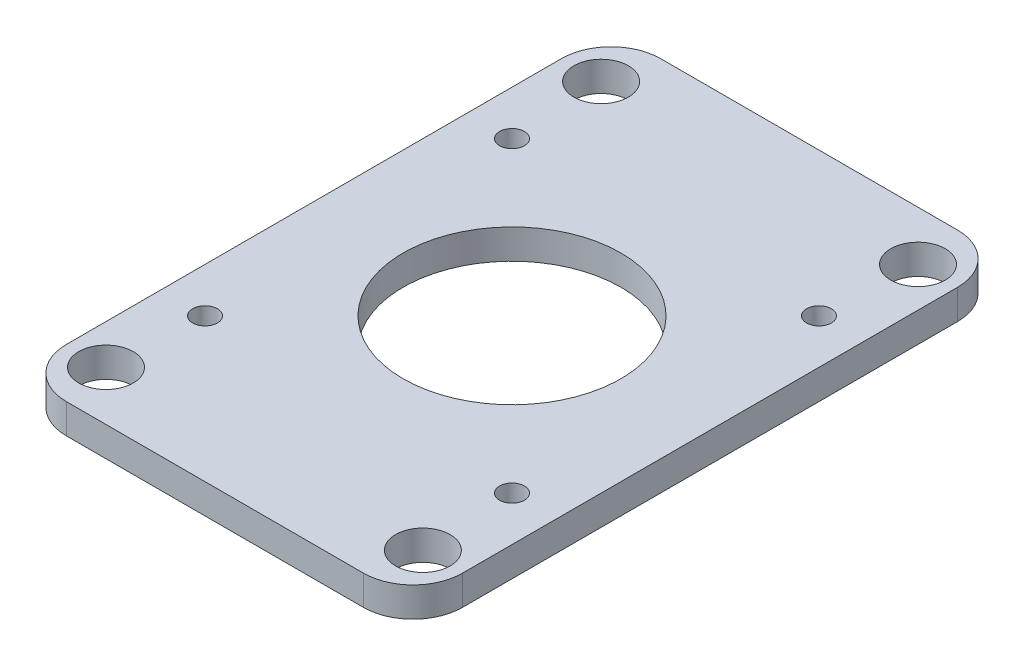
ISO-10303-21;
HEADER;
FILE_DESCRIPTION(('STEP AP214'),'2;1');
FILE_NAME('part.step','',(''),(''),'','','');
FILE_SCHEMA(('AUTOMOTIVE_DESIGN { 1 0 10303 214 1 1 1 1 }'));
ENDSEC;
DATA;
#1=APPLICATION_CONTEXT('core data for automotive mechanical design processes');
#2=APPLICATION_PROTOCOL_DEFINITION('international standard','automotive_design',2000,#1);
#3=PRODUCT_CONTEXT('',#1,'mechanical');
#4=PRODUCT('Part','Part','',(#3));
#5=PRODUCT_RELATED_PRODUCT_CATEGORY('part','',(#4));
#6=PRODUCT_DEFINITION_FORMATION('','',#4);
#7=PRODUCT_DEFINITION_CONTEXT('part definition',#1,'design');
#8=PRODUCT_DEFINITION('design','',#6,#7);
#9=PRODUCT_DEFINITION_SHAPE('','',#8);
#10=(LENGTH_UNIT() NAMED_UNIT(*) SI_UNIT(.MILLI.,.METRE.));
#11=(NAMED_UNIT(*) PLANE_ANGLE_UNIT() SI_UNIT($,.RADIAN.));
#12=(NAMED_UNIT(*) SI_UNIT($,.STERADIAN.) SOLID_ANGLE_UNIT());
#13=UNCERTAINTY_MEASURE_WITH_UNIT(LENGTH_MEASURE(1.E-05),#10,'distance_accuracy_value','');
#14=(GEOMETRIC_REPRESENTATION_CONTEXT(3) GLOBAL_UNCERTAINTY_ASSIGNED_CONTEXT((#13)) GLOBAL_UNIT_ASSIGNED_CONTEXT((#10,
#11,#12)) REPRESENTATION_CONTEXT('',''));
#15=CARTESIAN_POINT('',(0.,0.,0.));
#16=DIRECTION('',(0.,0.,1.));
#17=DIRECTION('',(1.,0.,0.));
#18=AXIS2_PLACEMENT_3D('',#15,#16,#17);
#19=CARTESIAN_POINT('',(20.,3.,0.));
#20=DIRECTION('',(1.,0.,0.));
#21=DIRECTION('',(0.,0.,-1.));
#22=AXIS2_PLACEMENT_3D('',#19,#20,#21);
#23=PLANE('',#22);
#24=DIRECTION('',(0.,0.,1.));
#25=VECTOR('',#24,1.);
#26=CARTESIAN_POINT('',(20.,3.,0.));
#27=LINE('',#26,#25);
#28=CARTESIAN_POINT('',(20.,3.,-25.));
#29=VERTEX_POINT('',#28);
#30=CARTESIAN_POINT('',(20.,3.,25.));
#31=VERTEX_POINT('',#30);
#32=EDGE_CURVE('E176',#29,#31,#27,.T.);
#33=ORIENTED_EDGE('',*,*,#32,.T.);
#34=DIRECTION('',(0.,-1.,0.));
#35=VECTOR('',#34,1.);
#36=CARTESIAN_POINT('',(20.,0.,25.));
#37=LINE('',#36,#35);
#38=CARTESIAN_POINT('',(20.,0.,25.));
#39=VERTEX_POINT('',#38);
#40=EDGE_CURVE('E168',#31,#39,#37,.T.);
#41=ORIENTED_EDGE('',*,*,#40,.T.);
#42=DIRECTION('',(0.,0.,1.));
#43=VECTOR('',#42,1.);
#44=CARTESIAN_POINT('',(20.,0.,0.));
#45=LINE('',#44,#43);
#46=CARTESIAN_POINT('',(20.,0.,-25.));
#47=VERTEX_POINT('',#46);
#48=EDGE_CURVE('E174',#47,#39,#45,.T.);
#49=ORIENTED_EDGE('',*,*,#48,.F.);
#50=DIRECTION('',(0.,-1.,0.));
#51=VECTOR('',#50,1.);
#52=CARTESIAN_POINT('',(20.,3.,-25.));
#53=LINE('',#52,#51);
#54=EDGE_CURVE('E166',#47,#29,#53,.F.);
#55=ORIENTED_EDGE('',*,*,#54,.T.);
#56=EDGE_LOOP('',(#33,#41,#49,#55));
#57=FACE_BOUND('',#56,.T.);
#58=ADVANCED_FACE('F35',(#57),#23,.T.);
#59=CARTESIAN_POINT('',(0.,3.,-30.));
#60=DIRECTION('',(0.,0.,-1.));
#61=DIRECTION('',(-1.,0.,0.));
#62=AXIS2_PLACEMENT_3D('',#59,#60,#61);
#63=PLANE('',#62);
#64=DIRECTION('',(1.,0.,0.));
#65=VECTOR('',#64,1.);
#66=CARTESIAN_POINT('',(0.,3.,-30.));
#67=LINE('',#66,#65);
#68=CARTESIAN_POINT('',(-15.,3.,-30.));
#69=VERTEX_POINT('',#68);
#70=CARTESIAN_POINT('',(15.,3.,-30.));
#71=VERTEX_POINT('',#70);
#72=EDGE_CURVE('E212',#69,#71,#67,.T.);
#73=ORIENTED_EDGE('',*,*,#72,.T.);
#74=DIRECTION('',(0.,-1.,0.));
#75=VECTOR('',#74,1.);
#76=CARTESIAN_POINT('',(15.,3.,-30.));
#77=LINE('',#76,#75);
#78=CARTESIAN_POINT('',(15.,0.,-30.));
#79=VERTEX_POINT('',#78);
#80=EDGE_CURVE('E11',#71,#79,#77,.T.);
#81=ORIENTED_EDGE('',*,*,#80,.T.);
#82=DIRECTION('',(1.,0.,0.));
#83=VECTOR('',#82,1.);
#84=CARTESIAN_POINT('',(0.,0.,-30.));
#85=LINE('',#84,#83);
#86=CARTESIAN_POINT('',(-15.,0.,-30.));
#87=VERTEX_POINT('',#86);
#88=EDGE_CURVE('E134',#87,#79,#85,.T.);
#89=ORIENTED_EDGE('',*,*,#88,.F.);
#90=DIRECTION('',(0.,-1.,0.));
#91=VECTOR('',#90,1.);
#92=CARTESIAN_POINT('',(-15.,3.,-30.));
#93=LINE('',#92,#91);
#94=EDGE_CURVE('E43',#87,#69,#93,.F.);
#95=ORIENTED_EDGE('',*,*,#94,.T.);
#96=EDGE_LOOP('',(#73,#81,#89,#95));
#97=FACE_BOUND('',#96,.T.);
#98=ADVANCED_FACE('F267',(#97),#63,.T.);
#99=CARTESIAN_POINT('',(-20.,3.,0.));
#100=DIRECTION('',(1.,0.,0.));
#101=DIRECTION('',(0.,0.,-1.));
#102=AXIS2_PLACEMENT_3D('',#99,#100,#101);
#103=PLANE('',#102);
#104=DIRECTION('',(0.,0.,1.));
#105=VECTOR('',#104,1.);
#106=CARTESIAN_POINT('',(-20.,0.,0.));
#107=LINE('',#106,#105);
#108=CARTESIAN_POINT('',(-20.,0.,-25.));
#109=VERTEX_POINT('',#108);
#110=CARTESIAN_POINT('',(-20.,0.,25.));
#111=VERTEX_POINT('',#110);
#112=EDGE_CURVE('E129',#109,#111,#107,.T.);
#113=ORIENTED_EDGE('',*,*,#112,.T.);
#114=DIRECTION('',(0.,-1.,0.));
#115=VECTOR('',#114,1.);
#116=CARTESIAN_POINT('',(-20.,3.,25.));
#117=LINE('',#116,#115);
#118=CARTESIAN_POINT('',(-20.,3.,25.));
#119=VERTEX_POINT('',#118);
#120=EDGE_CURVE('E106',#111,#119,#117,.F.);
#121=ORIENTED_EDGE('',*,*,#120,.T.);
#122=DIRECTION('',(0.,0.,1.));
#123=VECTOR('',#122,1.);
#124=CARTESIAN_POINT('',(-20.,3.,0.));
#125=LINE('',#124,#123);
#126=CARTESIAN_POINT('',(-20.,3.,-25.));
#127=VERTEX_POINT('',#126);
#128=EDGE_CURVE('E209',#127,#119,#125,.T.);
#129=ORIENTED_EDGE('',*,*,#128,.F.);
#130=DIRECTION('',(0.,-1.,0.));
#131=VECTOR('',#130,1.);
#132=CARTESIAN_POINT('',(-20.,0.,-25.));
#133=LINE('',#132,#131);
#134=EDGE_CURVE('E111',#127,#109,#133,.T.);
#135=ORIENTED_EDGE('',*,*,#134,.T.);
#136=EDGE_LOOP('',(#113,#121,#129,#135));
#137=FACE_BOUND('',#136,.T.);
#138=ADVANCED_FACE('F272',(#137),#103,.F.);
#139=CARTESIAN_POINT('',(-15.5,3.,15.5));
#140=DIRECTION('',(0.,-1.,0.));
#141=DIRECTION('',(0.,0.,-1.));
#142=AXIS2_PLACEMENT_3D('',#139,#140,#141);
#143=CYLINDRICAL_SURFACE('',#142,1.25);
#144=CARTESIAN_POINT('',(-15.5,3.,15.5));
#145=DIRECTION('',(0.,1.,0.));
#146=DIRECTION('',(0.,0.,1.));
#147=AXIS2_PLACEMENT_3D('',#144,#145,#146);
#148=CIRCLE('',#147,1.25);
#149=CARTESIAN_POINT('',(-15.5,3.,16.75));
#150=VERTEX_POINT('',#149);
#151=EDGE_CURVE('E196',#150,#150,#148,.T.);
#152=ORIENTED_EDGE('',*,*,#151,.T.);
#153=EDGE_LOOP('',(#152));
#154=FACE_BOUND('',#153,.T.);
#155=CARTESIAN_POINT('',(-15.5,0.,15.5));
#156=DIRECTION('',(0.,1.,0.));
#157=DIRECTION('',(0.,0.,1.));
#158=AXIS2_PLACEMENT_3D('',#155,#156,#157);
#159=CIRCLE('',#158,1.25);
#160=CARTESIAN_POINT('',(-15.5,0.,16.75));
#161=VERTEX_POINT('',#160);
#162=EDGE_CURVE('E143',#161,#161,#159,.T.);
#163=ORIENTED_EDGE('',*,*,#162,.F.);
#164=EDGE_LOOP('',(#163));
#165=FACE_BOUND('',#164,.T.);
#166=ADVANCED_FACE('F303',(#154,#165),#143,.F.);
#167=CARTESIAN_POINT('',(-15.5,3.,-15.5));
#168=DIRECTION('',(0.,-1.,0.));
#169=DIRECTION('',(0.,0.,-1.));
#170=AXIS2_PLACEMENT_3D('',#167,#168,#169);
#171=CYLINDRICAL_SURFACE('',#170,1.25);
#172=CARTESIAN_POINT('',(-15.5,3.,-15.5));
#173=DIRECTION('',(0.,1.,0.));
#174=DIRECTION('',(0.,0.,1.));
#175=AXIS2_PLACEMENT_3D('',#172,#173,#174);
#176=CIRCLE('',#175,1.25);
#177=CARTESIAN_POINT('',(-15.5,3.,-14.25));
#178=VERTEX_POINT('',#177);
#179=EDGE_CURVE('E199',#178,#178,#176,.T.);
#180=ORIENTED_EDGE('',*,*,#179,.T.);
#181=EDGE_LOOP('',(#180));
#182=FACE_BOUND('',#181,.T.);
#183=CARTESIAN_POINT('',(-15.5,0.,-15.5));
#184=DIRECTION('',(0.,1.,0.));
#185=DIRECTION('',(0.,0.,1.));
#186=AXIS2_PLACEMENT_3D('',#183,#184,#185);
#187=CIRCLE('',#186,1.25);
#188=CARTESIAN_POINT('',(-15.5,0.,-14.25));
#189=VERTEX_POINT('',#188);
#190=EDGE_CURVE('E140',#189,#189,#187,.T.);
#191=ORIENTED_EDGE('',*,*,#190,.F.);
#192=EDGE_LOOP('',(#191));
#193=FACE_BOUND('',#192,.T.);
#194=ADVANCED_FACE('F307',(#182,#193),#171,.F.);
#195=CARTESIAN_POINT('',(15.5,3.,-15.5));
#196=DIRECTION('',(0.,-1.,0.));
#197=DIRECTION('',(0.,0.,-1.));
#198=AXIS2_PLACEMENT_3D('',#195,#196,#197);
#199=CYLINDRICAL_SURFACE('',#198,1.25);
#200=CARTESIAN_POINT('',(15.5,3.,-15.5));
#201=DIRECTION('',(0.,1.,0.));
#202=DIRECTION('',(0.,0.,1.));
#203=AXIS2_PLACEMENT_3D('',#200,#201,#202);
#204=CIRCLE('',#203,1.25);
#205=CARTESIAN_POINT('',(15.5,3.,-14.25));
#206=VERTEX_POINT('',#205);
#207=EDGE_CURVE('E202',#206,#206,#204,.T.);
#208=ORIENTED_EDGE('',*,*,#207,.T.);
#209=EDGE_LOOP('',(#208));
#210=FACE_BOUND('',#209,.T.);
#211=CARTESIAN_POINT('',(15.5,0.,-15.5));
#212=DIRECTION('',(0.,1.,0.));
#213=DIRECTION('',(0.,0.,1.));
#214=AXIS2_PLACEMENT_3D('',#211,#212,#213);
#215=CIRCLE('',#214,1.25);
#216=CARTESIAN_POINT('',(15.5,0.,-14.25));
#217=VERTEX_POINT('',#216);
#218=EDGE_CURVE('E132',#217,#217,#215,.T.);
#219=ORIENTED_EDGE('',*,*,#218,.F.);
#220=EDGE_LOOP('',(#219));
#221=FACE_BOUND('',#220,.T.);
#222=ADVANCED_FACE('F316',(#210,#221),#199,.F.);
#223=CARTESIAN_POINT('',(15.5,3.,15.5));
#224=DIRECTION('',(0.,-1.,0.));
#225=DIRECTION('',(0.,0.,-1.));
#226=AXIS2_PLACEMENT_3D('',#223,#224,#225);
#227=CYLINDRICAL_SURFACE('',#226,1.25);
#228=CARTESIAN_POINT('',(15.5,3.,15.5));
#229=DIRECTION('',(0.,1.,0.));
#230=DIRECTION('',(0.,0.,1.));
#231=AXIS2_PLACEMENT_3D('',#228,#229,#230);
#232=CIRCLE('',#231,1.25);
#233=CARTESIAN_POINT('',(15.5,3.,16.75));
#234=VERTEX_POINT('',#233);
#235=EDGE_CURVE('E205',#234,#234,#232,.T.);
#236=ORIENTED_EDGE('',*,*,#235,.T.);
#237=EDGE_LOOP('',(#236));
#238=FACE_BOUND('',#237,.T.);
#239=CARTESIAN_POINT('',(15.5,0.,15.5));
#240=DIRECTION('',(0.,1.,0.));
#241=DIRECTION('',(0.,0.,1.));
#242=AXIS2_PLACEMENT_3D('',#239,#240,#241);
#243=CIRCLE('',#242,1.25);
#244=CARTESIAN_POINT('',(15.5,0.,16.75));
#245=VERTEX_POINT('',#244);
#246=EDGE_CURVE('E128',#245,#245,#243,.T.);
#247=ORIENTED_EDGE('',*,*,#246,.F.);
#248=EDGE_LOOP('',(#247));
#249=FACE_BOUND('',#248,.T.);
#250=ADVANCED_FACE('F313',(#238,#249),#227,.F.);
#251=CARTESIAN_POINT('',(0.,3.,30.));
#252=DIRECTION('',(0.,0.,-1.));
#253=DIRECTION('',(-1.,0.,0.));
#254=AXIS2_PLACEMENT_3D('',#251,#252,#253);
#255=PLANE('',#254);
#256=DIRECTION('',(1.,0.,0.));
#257=VECTOR('',#256,1.);
#258=CARTESIAN_POINT('',(0.,3.,30.));
#259=LINE('',#258,#257);
#260=CARTESIAN_POINT('',(-15.,3.,30.));
#261=VERTEX_POINT('',#260);
#262=CARTESIAN_POINT('',(15.,3.,30.));
#263=VERTEX_POINT('',#262);
#264=EDGE_CURVE('E121',#261,#263,#259,.T.);
#265=ORIENTED_EDGE('',*,*,#264,.F.);
#266=DIRECTION('',(0.,-1.,0.));
#267=VECTOR('',#266,1.);
#268=CARTESIAN_POINT('',(-15.,3.,30.));
#269=LINE('',#268,#267);
#270=CARTESIAN_POINT('',(-15.,0.,30.));
#271=VERTEX_POINT('',#270);
#272=EDGE_CURVE('E105',#261,#271,#269,.T.);
#273=ORIENTED_EDGE('',*,*,#272,.T.);
#274=DIRECTION('',(1.,0.,0.));
#275=VECTOR('',#274,1.);
#276=CARTESIAN_POINT('',(0.,0.,30.));
#277=LINE('',#276,#275);
#278=CARTESIAN_POINT('',(15.,0.,30.));
#279=VERTEX_POINT('',#278);
#280=EDGE_CURVE('E118',#271,#279,#277,.T.);
#281=ORIENTED_EDGE('',*,*,#280,.T.);
#282=DIRECTION('',(0.,-1.,0.));
#283=VECTOR('',#282,1.);
#284=CARTESIAN_POINT('',(15.,3.,30.));
#285=LINE('',#284,#283);
#286=EDGE_CURVE('E123',#279,#263,#285,.F.);
#287=ORIENTED_EDGE('',*,*,#286,.T.);
#288=EDGE_LOOP('',(#265,#273,#281,#287));
#289=FACE_BOUND('',#288,.T.);
#290=ADVANCED_FACE('F117',(#289),#255,.F.);
#291=CARTESIAN_POINT('',(-16.,3.,-25.));
#292=DIRECTION('',(0.,-1.,0.));
#293=DIRECTION('',(0.,0.,-1.));
#294=AXIS2_PLACEMENT_3D('',#291,#292,#293);
#295=CYLINDRICAL_SURFACE('',#294,2.75);
#296=CARTESIAN_POINT('',(-16.,3.,-25.));
#297=DIRECTION('',(0.,1.,0.));
#298=DIRECTION('',(0.,0.,1.));
#299=AXIS2_PLACEMENT_3D('',#296,#297,#298);
#300=CIRCLE('',#299,2.75);
#301=CARTESIAN_POINT('',(-16.,3.,-22.25));
#302=VERTEX_POINT('',#301);
#303=EDGE_CURVE('E215',#302,#302,#300,.T.);
#304=ORIENTED_EDGE('',*,*,#303,.T.);
#305=EDGE_LOOP('',(#304));
#306=FACE_BOUND('',#305,.T.);
#307=CARTESIAN_POINT('',(-16.,0.,-25.));
#308=DIRECTION('',(0.,1.,0.));
#309=DIRECTION('',(0.,0.,1.));
#310=AXIS2_PLACEMENT_3D('',#307,#308,#309);
#311=CIRCLE('',#310,2.75);
#312=CARTESIAN_POINT('',(-16.,0.,-22.25));
#313=VERTEX_POINT('',#312);
#314=EDGE_CURVE('E180',#313,#313,#311,.T.);
#315=ORIENTED_EDGE('',*,*,#314,.F.);
#316=EDGE_LOOP('',(#315));
#317=FACE_BOUND('',#316,.T.);
#318=ADVANCED_FACE('F276',(#306,#317),#295,.F.);
#319=CARTESIAN_POINT('',(16.,3.,-25.));
#320=DIRECTION('',(0.,-1.,0.));
#321=DIRECTION('',(0.,0.,-1.));
#322=AXIS2_PLACEMENT_3D('',#319,#320,#321);
#323=CYLINDRICAL_SURFACE('',#322,2.75);
#324=CARTESIAN_POINT('',(16.,3.,-25.));
#325=DIRECTION('',(0.,1.,0.));
#326=DIRECTION('',(0.,0.,1.));
#327=AXIS2_PLACEMENT_3D('',#324,#325,#326);
#328=CIRCLE('',#327,2.75);
#329=CARTESIAN_POINT('',(16.,3.,-22.25));
#330=VERTEX_POINT('',#329);
#331=EDGE_CURVE('E218',#330,#330,#328,.T.);
#332=ORIENTED_EDGE('',*,*,#331,.T.);
#333=EDGE_LOOP('',(#332));
#334=FACE_BOUND('',#333,.T.);
#335=CARTESIAN_POINT('',(16.,0.,-25.));
#336=DIRECTION('',(0.,1.,0.));
#337=DIRECTION('',(0.,0.,1.));
#338=AXIS2_PLACEMENT_3D('',#335,#336,#337);
#339=CIRCLE('',#338,2.75);
#340=CARTESIAN_POINT('',(16.,0.,-22.25));
#341=VERTEX_POINT('',#340);
#342=EDGE_CURVE('E183',#341,#341,#339,.T.);
#343=ORIENTED_EDGE('',*,*,#342,.F.);
#344=EDGE_LOOP('',(#343));
#345=FACE_BOUND('',#344,.T.);
#346=ADVANCED_FACE('F279',(#334,#345),#323,.F.);
#347=CARTESIAN_POINT('',(-16.,3.,25.));
#348=DIRECTION('',(0.,-1.,0.));
#349=DIRECTION('',(0.,0.,-1.));
#350=AXIS2_PLACEMENT_3D('',#347,#348,#349);
#351=CYLINDRICAL_SURFACE('',#350,2.75);
#352=CARTESIAN_POINT('',(-16.,3.,25.));
#353=DIRECTION('',(0.,1.,0.));
#354=DIRECTION('',(0.,0.,1.));
#355=AXIS2_PLACEMENT_3D('',#352,#353,#354);
#356=CIRCLE('',#355,2.75);
#357=CARTESIAN_POINT('',(-16.,3.,27.75));
#358=VERTEX_POINT('',#357);
#359=EDGE_CURVE('E221',#358,#358,#356,.T.);
#360=ORIENTED_EDGE('',*,*,#359,.T.);
#361=EDGE_LOOP('',(#360));
#362=FACE_BOUND('',#361,.T.);
#363=CARTESIAN_POINT('',(-16.,0.,25.));
#364=DIRECTION('',(0.,1.,0.));
#365=DIRECTION('',(0.,0.,1.));
#366=AXIS2_PLACEMENT_3D('',#363,#364,#365);
#367=CIRCLE('',#366,2.75);
#368=CARTESIAN_POINT('',(-16.,0.,27.75));
#369=VERTEX_POINT('',#368);
#370=EDGE_CURVE('E188',#369,#369,#367,.T.);
#371=ORIENTED_EDGE('',*,*,#370,.F.);
#372=EDGE_LOOP('',(#371));
#373=FACE_BOUND('',#372,.T.);
#374=ADVANCED_FACE('F283',(#362,#373),#351,.F.);
#375=CARTESIAN_POINT('',(16.,3.,25.));
#376=DIRECTION('',(0.,-1.,0.));
#377=DIRECTION('',(0.,0.,-1.));
#378=AXIS2_PLACEMENT_3D('',#375,#376,#377);
#379=CYLINDRICAL_SURFACE('',#378,2.75000000000001);
#380=CARTESIAN_POINT('',(16.,3.,25.));
#381=DIRECTION('',(0.,1.,0.));
#382=DIRECTION('',(0.,0.,1.));
#383=AXIS2_PLACEMENT_3D('',#380,#381,#382);
#384=CIRCLE('',#383,2.75000000000001);
#385=CARTESIAN_POINT('',(16.,3.,27.75));
#386=VERTEX_POINT('',#385);
#387=EDGE_CURVE('E149',#386,#386,#384,.T.);
#388=ORIENTED_EDGE('',*,*,#387,.T.);
#389=EDGE_LOOP('',(#388));
#390=FACE_BOUND('',#389,.T.);
#391=CARTESIAN_POINT('',(16.,0.,25.));
#392=DIRECTION('',(0.,1.,0.));
#393=DIRECTION('',(0.,0.,1.));
#394=AXIS2_PLACEMENT_3D('',#391,#392,#393);
#395=CIRCLE('',#394,2.75000000000001);
#396=CARTESIAN_POINT('',(16.,0.,27.75));
#397=VERTEX_POINT('',#396);
#398=EDGE_CURVE('E191',#397,#397,#395,.T.);
#399=ORIENTED_EDGE('',*,*,#398,.F.);
#400=EDGE_LOOP('',(#399));
#401=FACE_BOUND('',#400,.T.);
#402=ADVANCED_FACE('F227',(#390,#401),#379,.F.);
#403=CARTESIAN_POINT('',(0.,3.,0.));
#404=DIRECTION('',(0.,-1.,0.));
#405=DIRECTION('',(0.,0.,-1.));
#406=AXIS2_PLACEMENT_3D('',#403,#404,#405);
#407=CYLINDRICAL_SURFACE('',#406,11.);
#408=CARTESIAN_POINT('',(0.,3.,0.));
#409=DIRECTION('',(0.,1.,0.));
#410=DIRECTION('',(0.,0.,1.));
#411=AXIS2_PLACEMENT_3D('',#408,#409,#410);
#412=CIRCLE('',#411,11.);
#413=CARTESIAN_POINT('',(0.,3.,11.));
#414=VERTEX_POINT('',#413);
#415=EDGE_CURVE('E150',#414,#414,#412,.T.);
#416=ORIENTED_EDGE('',*,*,#415,.T.);
#417=EDGE_LOOP('',(#416));
#418=FACE_BOUND('',#417,.T.);
#419=CARTESIAN_POINT('',(0.,0.,0.));
#420=DIRECTION('',(0.,1.,0.));
#421=DIRECTION('',(0.,0.,1.));
#422=AXIS2_PLACEMENT_3D('',#419,#420,#421);
#423=CIRCLE('',#422,11.);
#424=CARTESIAN_POINT('',(0.,0.,11.));
#425=VERTEX_POINT('',#424);
#426=EDGE_CURVE('E146',#425,#425,#423,.T.);
#427=ORIENTED_EDGE('',*,*,#426,.F.);
#428=EDGE_LOOP('',(#427));
#429=FACE_BOUND('',#428,.T.);
#430=ADVANCED_FACE('F233',(#418,#429),#407,.F.);
#431=CARTESIAN_POINT('',(0.,3.,0.));
#432=DIRECTION('',(0.,1.,0.));
#433=DIRECTION('',(0.,0.,1.));
#434=AXIS2_PLACEMENT_3D('',#431,#432,#433);
#435=PLANE('',#434);
#436=ORIENTED_EDGE('',*,*,#387,.F.);
#437=EDGE_LOOP('',(#436));
#438=FACE_BOUND('',#437,.T.);
#439=ORIENTED_EDGE('',*,*,#359,.F.);
#440=EDGE_LOOP('',(#439));
#441=FACE_BOUND('',#440,.T.);
#442=ORIENTED_EDGE('',*,*,#331,.F.);
#443=EDGE_LOOP('',(#442));
#444=FACE_BOUND('',#443,.T.);
#445=ORIENTED_EDGE('',*,*,#303,.F.);
#446=EDGE_LOOP('',(#445));
#447=FACE_BOUND('',#446,.T.);
#448=ORIENTED_EDGE('',*,*,#128,.T.);
#449=CARTESIAN_POINT('',(-15.,3.,25.));
#450=DIRECTION('',(0.,1.,0.));
#451=DIRECTION('',(0.,0.,1.));
#452=AXIS2_PLACEMENT_3D('',#449,#450,#451);
#453=CIRCLE('',#452,5.);
#454=EDGE_CURVE('E164',#119,#261,#453,.T.);
#455=ORIENTED_EDGE('',*,*,#454,.T.);
#456=ORIENTED_EDGE('',*,*,#264,.T.);
#457=CARTESIAN_POINT('',(15.,3.,25.));
#458=DIRECTION('',(0.,1.,0.));
#459=DIRECTION('',(0.,0.,1.));
#460=AXIS2_PLACEMENT_3D('',#457,#458,#459);
#461=CIRCLE('',#460,5.);
#462=EDGE_CURVE('E162',#263,#31,#461,.T.);
#463=ORIENTED_EDGE('',*,*,#462,.T.);
#464=ORIENTED_EDGE('',*,*,#32,.F.);
#465=CARTESIAN_POINT('',(15.,3.,-25.));
#466=DIRECTION('',(0.,1.,0.));
#467=DIRECTION('',(0.,0.,1.));
#468=AXIS2_PLACEMENT_3D('',#465,#466,#467);
#469=CIRCLE('',#468,5.);
#470=EDGE_CURVE('E50',#29,#71,#469,.T.);
#471=ORIENTED_EDGE('',*,*,#470,.T.);
#472=ORIENTED_EDGE('',*,*,#72,.F.);
#473=CARTESIAN_POINT('',(-15.,3.,-25.));
#474=DIRECTION('',(0.,1.,0.));
#475=DIRECTION('',(0.,0.,1.));
#476=AXIS2_PLACEMENT_3D('',#473,#474,#475);
#477=CIRCLE('',#476,5.);
#478=EDGE_CURVE('E159',#69,#127,#477,.T.);
#479=ORIENTED_EDGE('',*,*,#478,.T.);
#480=EDGE_LOOP('',(#448,#455,#456,#463,#464,#471,#472,#479));
#481=FACE_BOUND('',#480,.T.);
#482=ORIENTED_EDGE('',*,*,#235,.F.);
#483=EDGE_LOOP('',(#482));
#484=FACE_BOUND('',#483,.T.);
#485=ORIENTED_EDGE('',*,*,#207,.F.);
#486=EDGE_LOOP('',(#485));
#487=FACE_BOUND('',#486,.T.);
#488=ORIENTED_EDGE('',*,*,#179,.F.);
#489=EDGE_LOOP('',(#488));
#490=FACE_BOUND('',#489,.T.);
#491=ORIENTED_EDGE('',*,*,#151,.F.);
#492=EDGE_LOOP('',(#491));
#493=FACE_BOUND('',#492,.T.);
#494=ORIENTED_EDGE('',*,*,#415,.F.);
#495=EDGE_LOOP('',(#494));
#496=FACE_BOUND('',#495,.T.);
#497=ADVANCED_FACE('F230',(#438,#441,#444,#447,#481,#484,#487,#490,#493,#496),#435,.T.);
#498=CARTESIAN_POINT('',(0.,0.,0.));
#499=DIRECTION('',(0.,1.,0.));
#500=DIRECTION('',(0.,0.,1.));
#501=AXIS2_PLACEMENT_3D('',#498,#499,#500);
#502=PLANE('',#501);
#503=ORIENTED_EDGE('',*,*,#398,.T.);
#504=EDGE_LOOP('',(#503));
#505=FACE_BOUND('',#504,.T.);
#506=ORIENTED_EDGE('',*,*,#370,.T.);
#507=EDGE_LOOP('',(#506));
#508=FACE_BOUND('',#507,.T.);
#509=ORIENTED_EDGE('',*,*,#342,.T.);
#510=EDGE_LOOP('',(#509));
#511=FACE_BOUND('',#510,.T.);
#512=ORIENTED_EDGE('',*,*,#314,.T.);
#513=EDGE_LOOP('',(#512));
#514=FACE_BOUND('',#513,.T.);
#515=ORIENTED_EDGE('',*,*,#280,.F.);
#516=CARTESIAN_POINT('',(-15.,0.,25.));
#517=DIRECTION('',(0.,1.,0.));
#518=DIRECTION('',(0.,0.,1.));
#519=AXIS2_PLACEMENT_3D('',#516,#517,#518);
#520=CIRCLE('',#519,5.);
#521=EDGE_CURVE('E101',#271,#111,#520,.F.);
#522=ORIENTED_EDGE('',*,*,#521,.T.);
#523=ORIENTED_EDGE('',*,*,#112,.F.);
#524=CARTESIAN_POINT('',(-15.,0.,-25.));
#525=DIRECTION('',(0.,1.,0.));
#526=DIRECTION('',(0.,0.,1.));
#527=AXIS2_PLACEMENT_3D('',#524,#525,#526);
#528=CIRCLE('',#527,5.);
#529=EDGE_CURVE('E122',#109,#87,#528,.F.);
#530=ORIENTED_EDGE('',*,*,#529,.T.);
#531=ORIENTED_EDGE('',*,*,#88,.T.);
#532=CARTESIAN_POINT('',(15.,0.,-25.));
#533=DIRECTION('',(0.,1.,0.));
#534=DIRECTION('',(0.,0.,1.));
#535=AXIS2_PLACEMENT_3D('',#532,#533,#534);
#536=CIRCLE('',#535,5.);
#537=EDGE_CURVE('E153',#79,#47,#536,.F.);
#538=ORIENTED_EDGE('',*,*,#537,.T.);
#539=ORIENTED_EDGE('',*,*,#48,.T.);
#540=CARTESIAN_POINT('',(15.,0.,25.));
#541=DIRECTION('',(0.,1.,0.));
#542=DIRECTION('',(0.,0.,1.));
#543=AXIS2_PLACEMENT_3D('',#540,#541,#542);
#544=CIRCLE('',#543,5.);
#545=EDGE_CURVE('E112',#39,#279,#544,.F.);
#546=ORIENTED_EDGE('',*,*,#545,.T.);
#547=EDGE_LOOP('',(#515,#522,#523,#530,#531,#538,#539,#546));
#548=FACE_BOUND('',#547,.T.);
#549=ORIENTED_EDGE('',*,*,#246,.T.);
#550=EDGE_LOOP('',(#549));
#551=FACE_BOUND('',#550,.T.);
#552=ORIENTED_EDGE('',*,*,#218,.T.);
#553=EDGE_LOOP('',(#552));
#554=FACE_BOUND('',#553,.T.);
#555=ORIENTED_EDGE('',*,*,#190,.T.);
#556=EDGE_LOOP('',(#555));
#557=FACE_BOUND('',#556,.T.);
#558=ORIENTED_EDGE('',*,*,#162,.T.);
#559=EDGE_LOOP('',(#558));
#560=FACE_BOUND('',#559,.T.);
#561=ORIENTED_EDGE('',*,*,#426,.T.);
#562=EDGE_LOOP('',(#561));
#563=FACE_BOUND('',#562,.T.);
#564=ADVANCED_FACE('F125',(#505,#508,#511,#514,#548,#551,#554,#557,#560,#563),#502,.F.);
#565=CARTESIAN_POINT('',(-15.,3.,25.));
#566=DIRECTION('',(0.,-1.,0.));
#567=DIRECTION('',(0.,0.,-1.));
#568=AXIS2_PLACEMENT_3D('',#565,#566,#567);
#569=CYLINDRICAL_SURFACE('',#568,5.);
#570=ORIENTED_EDGE('',*,*,#454,.F.);
#571=ORIENTED_EDGE('',*,*,#120,.F.);
#572=ORIENTED_EDGE('',*,*,#521,.F.);
#573=ORIENTED_EDGE('',*,*,#272,.F.);
#574=EDGE_LOOP('',(#570,#571,#572,#573));
#575=FACE_BOUND('',#574,.T.);
#576=ADVANCED_FACE('F104',(#575),#569,.T.);
#577=CARTESIAN_POINT('',(15.,3.,25.));
#578=DIRECTION('',(0.,1.,0.));
#579=DIRECTION('',(0.,0.,1.));
#580=AXIS2_PLACEMENT_3D('',#577,#578,#579);
#581=CYLINDRICAL_SURFACE('',#580,5.);
#582=ORIENTED_EDGE('',*,*,#462,.F.);
#583=ORIENTED_EDGE('',*,*,#286,.F.);
#584=ORIENTED_EDGE('',*,*,#545,.F.);
#585=ORIENTED_EDGE('',*,*,#40,.F.);
#586=EDGE_LOOP('',(#582,#583,#584,#585));
#587=FACE_BOUND('',#586,.T.);
#588=ADVANCED_FACE('F263',(#587),#581,.T.);
#589=CARTESIAN_POINT('',(15.,3.,-25.));
#590=DIRECTION('',(0.,-1.,0.));
#591=DIRECTION('',(0.,0.,-1.));
#592=AXIS2_PLACEMENT_3D('',#589,#590,#591);
#593=CYLINDRICAL_SURFACE('',#592,5.);
#594=ORIENTED_EDGE('',*,*,#470,.F.);
#595=ORIENTED_EDGE('',*,*,#54,.F.);
#596=ORIENTED_EDGE('',*,*,#537,.F.);
#597=ORIENTED_EDGE('',*,*,#80,.F.);
#598=EDGE_LOOP('',(#594,#595,#596,#597));
#599=FACE_BOUND('',#598,.T.);
#600=ADVANCED_FACE('F291',(#599),#593,.T.);
#601=CARTESIAN_POINT('',(-15.,3.,-25.));
#602=DIRECTION('',(0.,1.,0.));
#603=DIRECTION('',(0.,0.,1.));
#604=AXIS2_PLACEMENT_3D('',#601,#602,#603);
#605=CYLINDRICAL_SURFACE('',#604,5.);
#606=ORIENTED_EDGE('',*,*,#478,.F.);
#607=ORIENTED_EDGE('',*,*,#94,.F.);
#608=ORIENTED_EDGE('',*,*,#529,.F.);
#609=ORIENTED_EDGE('',*,*,#134,.F.);
#610=EDGE_LOOP('',(#606,#607,#608,#609));
#611=FACE_BOUND('',#610,.T.);
#612=ADVANCED_FACE('F37',(#611),#605,.T.);
#613=CLOSED_SHELL('',(#58,#98,#138,#166,#194,#222,#250,#290,#318,#346,#374,#402,#430,#497,#564,
#576,#588,#600,#612));
#614=MANIFOLD_SOLID_BREP('B2',#613);
#615=ADVANCED_BREP_SHAPE_REPRESENTATION('',(#18,#614),#14);
#616=SHAPE_DEFINITION_REPRESENTATION(#9,#615);
ENDSEC;
END-ISO-10303-21;
